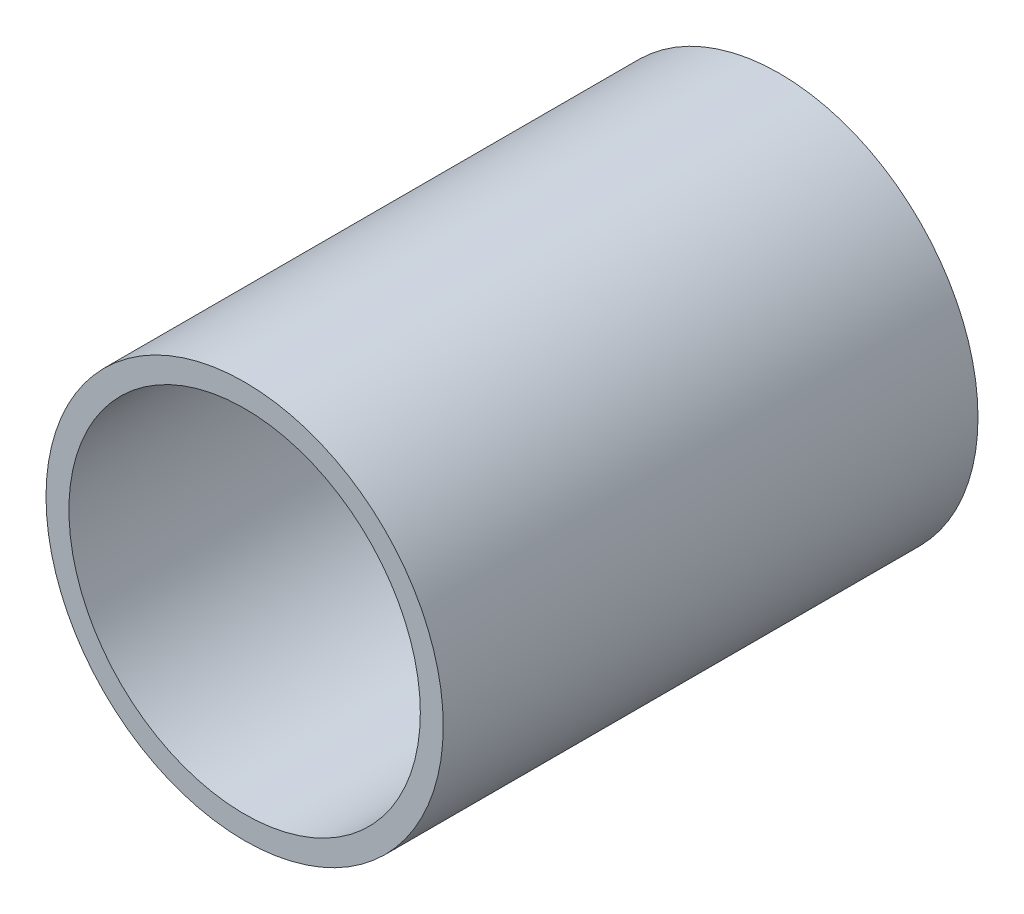
ISO-10303-21;
HEADER;
FILE_DESCRIPTION(('STEP AP214'),'2;1');
FILE_NAME('part.step','',(''),(''),'','','');
FILE_SCHEMA(('AUTOMOTIVE_DESIGN { 1 0 10303 214 1 1 1 1 }'));
ENDSEC;
DATA;
#1=APPLICATION_CONTEXT('core data for automotive mechanical design processes');
#2=APPLICATION_PROTOCOL_DEFINITION('international standard','automotive_design',2000,#1);
#3=PRODUCT_CONTEXT('',#1,'mechanical');
#4=PRODUCT('Part','Part','',(#3));
#5=PRODUCT_RELATED_PRODUCT_CATEGORY('part','',(#4));
#6=PRODUCT_DEFINITION_FORMATION('','',#4);
#7=PRODUCT_DEFINITION_CONTEXT('part definition',#1,'design');
#8=PRODUCT_DEFINITION('design','',#6,#7);
#9=PRODUCT_DEFINITION_SHAPE('','',#8);
#10=(LENGTH_UNIT() NAMED_UNIT(*) SI_UNIT(.MILLI.,.METRE.));
#11=(NAMED_UNIT(*) PLANE_ANGLE_UNIT() SI_UNIT($,.RADIAN.));
#12=(NAMED_UNIT(*) SI_UNIT($,.STERADIAN.) SOLID_ANGLE_UNIT());
#13=UNCERTAINTY_MEASURE_WITH_UNIT(LENGTH_MEASURE(1.E-05),#10,'distance_accuracy_value','');
#14=(GEOMETRIC_REPRESENTATION_CONTEXT(3) GLOBAL_UNCERTAINTY_ASSIGNED_CONTEXT((#13)) GLOBAL_UNIT_ASSIGNED_CONTEXT((#10,
#11,#12)) REPRESENTATION_CONTEXT('',''));
#15=CARTESIAN_POINT('',(0.,0.,0.));
#16=DIRECTION('',(0.,0.,1.));
#17=DIRECTION('',(1.,0.,0.));
#18=AXIS2_PLACEMENT_3D('',#15,#16,#17);
#19=CARTESIAN_POINT('',(0.,0.,35.));
#20=DIRECTION('',(0.,0.,1.));
#21=DIRECTION('',(1.,0.,0.));
#22=AXIS2_PLACEMENT_3D('',#19,#20,#21);
#23=PLANE('',#22);
#24=CARTESIAN_POINT('',(0.,0.,35.));
#25=DIRECTION('',(0.,0.,1.));
#26=DIRECTION('',(1.,0.,0.));
#27=AXIS2_PLACEMENT_3D('',#24,#25,#26);
#28=CIRCLE('',#27,26.);
#29=CARTESIAN_POINT('',(26.,0.,35.));
#30=VERTEX_POINT('',#29);
#31=EDGE_CURVE('E10',#30,#30,#28,.T.);
#32=ORIENTED_EDGE('',*,*,#31,.T.);
#33=EDGE_LOOP('',(#32));
#34=FACE_BOUND('',#33,.T.);
#35=CARTESIAN_POINT('',(0.,0.,35.));
#36=DIRECTION('',(0.,0.,1.));
#37=DIRECTION('',(1.,0.,0.));
#38=AXIS2_PLACEMENT_3D('',#35,#36,#37);
#39=CIRCLE('',#38,23.);
#40=CARTESIAN_POINT('',(23.,0.,35.));
#41=VERTEX_POINT('',#40);
#42=EDGE_CURVE('E48',#41,#41,#39,.T.);
#43=ORIENTED_EDGE('',*,*,#42,.F.);
#44=EDGE_LOOP('',(#43));
#45=FACE_BOUND('',#44,.T.);
#46=ADVANCED_FACE('F37',(#34,#45),#23,.T.);
#47=CARTESIAN_POINT('',(0.,0.,-35.));
#48=DIRECTION('',(0.,0.,1.));
#49=DIRECTION('',(1.,0.,0.));
#50=AXIS2_PLACEMENT_3D('',#47,#48,#49);
#51=PLANE('',#50);
#52=CARTESIAN_POINT('',(0.,0.,-35.));
#53=DIRECTION('',(0.,0.,1.));
#54=DIRECTION('',(1.,0.,0.));
#55=AXIS2_PLACEMENT_3D('',#52,#53,#54);
#56=CIRCLE('',#55,26.);
#57=CARTESIAN_POINT('',(26.,0.,-35.));
#58=VERTEX_POINT('',#57);
#59=EDGE_CURVE('E41',#58,#58,#56,.T.);
#60=ORIENTED_EDGE('',*,*,#59,.F.);
#61=EDGE_LOOP('',(#60));
#62=FACE_BOUND('',#61,.T.);
#63=CARTESIAN_POINT('',(0.,0.,-35.));
#64=DIRECTION('',(0.,0.,1.));
#65=DIRECTION('',(1.,0.,0.));
#66=AXIS2_PLACEMENT_3D('',#63,#64,#65);
#67=CIRCLE('',#66,23.);
#68=CARTESIAN_POINT('',(23.,0.,-35.));
#69=VERTEX_POINT('',#68);
#70=EDGE_CURVE('E50',#69,#69,#67,.T.);
#71=ORIENTED_EDGE('',*,*,#70,.T.);
#72=EDGE_LOOP('',(#71));
#73=FACE_BOUND('',#72,.T.);
#74=ADVANCED_FACE('F60',(#62,#73),#51,.F.);
#75=CARTESIAN_POINT('',(0.,0.,35.));
#76=DIRECTION('',(0.,0.,-1.));
#77=DIRECTION('',(-1.,0.,0.));
#78=AXIS2_PLACEMENT_3D('',#75,#76,#77);
#79=CYLINDRICAL_SURFACE('',#78,26.);
#80=ORIENTED_EDGE('',*,*,#31,.F.);
#81=EDGE_LOOP('',(#80));
#82=FACE_BOUND('',#81,.T.);
#83=ORIENTED_EDGE('',*,*,#59,.T.);
#84=EDGE_LOOP('',(#83));
#85=FACE_BOUND('',#84,.T.);
#86=ADVANCED_FACE('F39',(#82,#85),#79,.T.);
#87=CARTESIAN_POINT('',(0.,0.,35.));
#88=DIRECTION('',(0.,0.,-1.));
#89=DIRECTION('',(-1.,0.,0.));
#90=AXIS2_PLACEMENT_3D('',#87,#88,#89);
#91=CYLINDRICAL_SURFACE('',#90,23.);
#92=ORIENTED_EDGE('',*,*,#42,.T.);
#93=EDGE_LOOP('',(#92));
#94=FACE_BOUND('',#93,.T.);
#95=ORIENTED_EDGE('',*,*,#70,.F.);
#96=EDGE_LOOP('',(#95));
#97=FACE_BOUND('',#96,.T.);
#98=ADVANCED_FACE('F56',(#94,#97),#91,.F.);
#99=CLOSED_SHELL('',(#46,#74,#86,#98));
#100=MANIFOLD_SOLID_BREP('B2',#99);
#101=ADVANCED_BREP_SHAPE_REPRESENTATION('',(#18,#100),#14);
#102=SHAPE_DEFINITION_REPRESENTATION(#9,#101);
ENDSEC;
END-ISO-10303-21;
